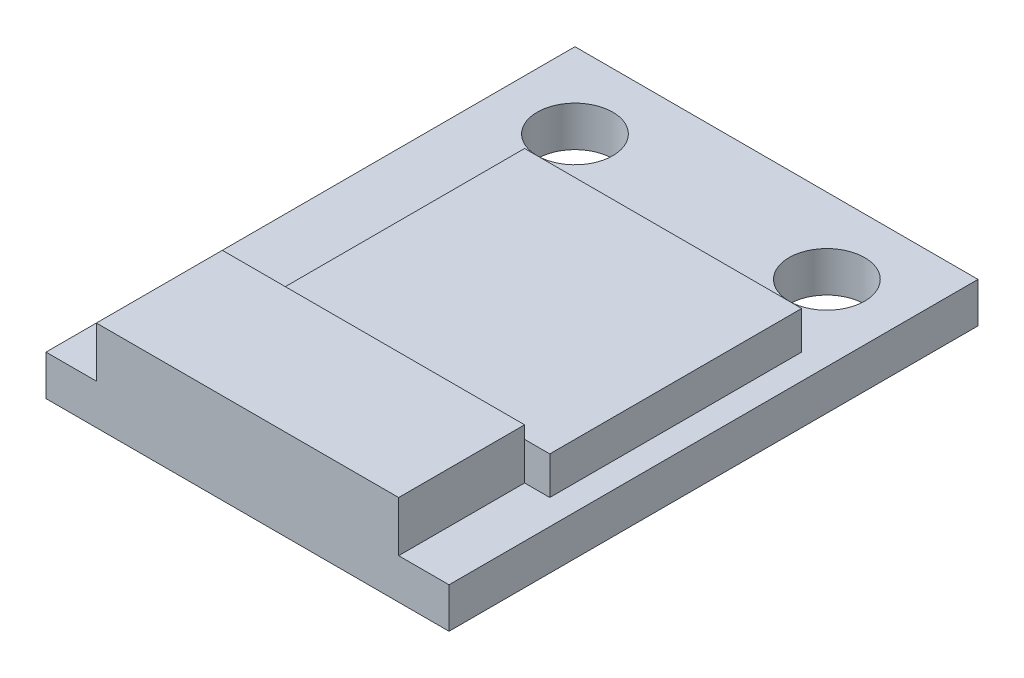
ISO-10303-21;
HEADER;
FILE_DESCRIPTION(('STEP AP214'),'2;1');
FILE_NAME('part.step','',(''),(''),'','','');
FILE_SCHEMA(('AUTOMOTIVE_DESIGN { 1 0 10303 214 1 1 1 1 }'));
ENDSEC;
DATA;
#1=APPLICATION_CONTEXT('core data for automotive mechanical design processes');
#2=APPLICATION_PROTOCOL_DEFINITION('international standard','automotive_design',2000,#1);
#3=PRODUCT_CONTEXT('',#1,'mechanical');
#4=PRODUCT('Part','Part','',(#3));
#5=PRODUCT_RELATED_PRODUCT_CATEGORY('part','',(#4));
#6=PRODUCT_DEFINITION_FORMATION('','',#4);
#7=PRODUCT_DEFINITION_CONTEXT('part definition',#1,'design');
#8=PRODUCT_DEFINITION('design','',#6,#7);
#9=PRODUCT_DEFINITION_SHAPE('','',#8);
#10=(LENGTH_UNIT() NAMED_UNIT(*) SI_UNIT(.MILLI.,.METRE.));
#11=(NAMED_UNIT(*) PLANE_ANGLE_UNIT() SI_UNIT($,.RADIAN.));
#12=(NAMED_UNIT(*) SI_UNIT($,.STERADIAN.) SOLID_ANGLE_UNIT());
#13=UNCERTAINTY_MEASURE_WITH_UNIT(LENGTH_MEASURE(1.E-05),#10,'distance_accuracy_value','');
#14=(GEOMETRIC_REPRESENTATION_CONTEXT(3) GLOBAL_UNCERTAINTY_ASSIGNED_CONTEXT((#13)) GLOBAL_UNIT_ASSIGNED_CONTEXT((#10,
#11,#12)) REPRESENTATION_CONTEXT('',''));
#15=CARTESIAN_POINT('',(0.,0.,0.));
#16=DIRECTION('',(0.,0.,1.));
#17=DIRECTION('',(1.,0.,0.));
#18=AXIS2_PLACEMENT_3D('',#15,#16,#17);
#19=CARTESIAN_POINT('',(0.,1.6,0.));
#20=DIRECTION('',(0.,-1.,0.));
#21=DIRECTION('',(0.,0.,-1.));
#22=AXIS2_PLACEMENT_3D('',#19,#20,#21);
#23=PLANE('',#22);
#24=CARTESIAN_POINT('',(3.,1.6,-18.));
#25=DIRECTION('',(0.,1.,0.));
#26=DIRECTION('',(0.,0.,1.));
#27=AXIS2_PLACEMENT_3D('',#24,#25,#26);
#28=CIRCLE('',#27,1.5);
#29=CARTESIAN_POINT('',(3.,1.6,-16.5));
#30=VERTEX_POINT('',#29);
#31=EDGE_CURVE('E195',#30,#30,#28,.T.);
#32=ORIENTED_EDGE('',*,*,#31,.F.);
#33=EDGE_LOOP('',(#32));
#34=FACE_BOUND('',#33,.T.);
#35=CARTESIAN_POINT('',(13.,1.6,-18.));
#36=DIRECTION('',(0.,1.,0.));
#37=DIRECTION('',(0.,0.,1.));
#38=AXIS2_PLACEMENT_3D('',#35,#36,#37);
#39=CIRCLE('',#38,1.5);
#40=CARTESIAN_POINT('',(13.,1.6,-16.5));
#41=VERTEX_POINT('',#40);
#42=EDGE_CURVE('E189',#41,#41,#39,.T.);
#43=ORIENTED_EDGE('',*,*,#42,.F.);
#44=EDGE_LOOP('',(#43));
#45=FACE_BOUND('',#44,.T.);
#46=DIRECTION('',(0.,0.,-1.));
#47=VECTOR('',#46,1.);
#48=CARTESIAN_POINT('',(14.,1.6,-5.));
#49=LINE('',#48,#47);
#50=CARTESIAN_POINT('',(14.,1.6,0.));
#51=VERTEX_POINT('',#50);
#52=CARTESIAN_POINT('',(14.,1.6,-5.));
#53=VERTEX_POINT('',#52);
#54=EDGE_CURVE('E245',#51,#53,#49,.T.);
#55=ORIENTED_EDGE('',*,*,#54,.F.);
#56=DIRECTION('',(1.,0.,0.));
#57=VECTOR('',#56,1.);
#58=CARTESIAN_POINT('',(0.,1.6,0.));
#59=LINE('',#58,#57);
#60=CARTESIAN_POINT('',(16.,1.6,0.));
#61=VERTEX_POINT('',#60);
#62=EDGE_CURVE('E204',#51,#61,#59,.T.);
#63=ORIENTED_EDGE('',*,*,#62,.T.);
#64=DIRECTION('',(0.,0.,-1.));
#65=VECTOR('',#64,1.);
#66=CARTESIAN_POINT('',(16.,1.6,0.));
#67=LINE('',#66,#65);
#68=CARTESIAN_POINT('',(16.,1.6,-21.));
#69=VERTEX_POINT('',#68);
#70=EDGE_CURVE('E208',#61,#69,#67,.T.);
#71=ORIENTED_EDGE('',*,*,#70,.T.);
#72=DIRECTION('',(-1.,0.,0.));
#73=VECTOR('',#72,1.);
#74=CARTESIAN_POINT('',(0.,1.6,-21.));
#75=LINE('',#74,#73);
#76=CARTESIAN_POINT('',(0.,1.6,-21.));
#77=VERTEX_POINT('',#76);
#78=EDGE_CURVE('E210',#69,#77,#75,.T.);
#79=ORIENTED_EDGE('',*,*,#78,.T.);
#80=DIRECTION('',(0.,0.,1.));
#81=VECTOR('',#80,1.);
#82=CARTESIAN_POINT('',(0.,1.6,0.));
#83=LINE('',#82,#81);
#84=CARTESIAN_POINT('',(0.,1.6,0.));
#85=VERTEX_POINT('',#84);
#86=EDGE_CURVE('E201',#77,#85,#83,.T.);
#87=ORIENTED_EDGE('',*,*,#86,.T.);
#88=CARTESIAN_POINT('',(2.,1.6,0.));
#89=VERTEX_POINT('',#88);
#90=EDGE_CURVE('E206',#85,#89,#59,.T.);
#91=ORIENTED_EDGE('',*,*,#90,.T.);
#92=DIRECTION('',(0.,0.,1.));
#93=VECTOR('',#92,1.);
#94=CARTESIAN_POINT('',(2.,1.6,-5.));
#95=LINE('',#94,#93);
#96=CARTESIAN_POINT('',(2.,1.6,-5.));
#97=VERTEX_POINT('',#96);
#98=EDGE_CURVE('E150',#97,#89,#95,.T.);
#99=ORIENTED_EDGE('',*,*,#98,.F.);
#100=DIRECTION('',(-1.,0.,0.));
#101=VECTOR('',#100,1.);
#102=CARTESIAN_POINT('',(2.,1.6,-5.));
#103=LINE('',#102,#101);
#104=CARTESIAN_POINT('',(4.,1.6,-5.));
#105=VERTEX_POINT('',#104);
#106=EDGE_CURVE('E146',#105,#97,#103,.T.);
#107=ORIENTED_EDGE('',*,*,#106,.F.);
#108=DIRECTION('',(0.,0.,1.));
#109=VECTOR('',#108,1.);
#110=CARTESIAN_POINT('',(4.,1.6,-15.));
#111=LINE('',#110,#109);
#112=CARTESIAN_POINT('',(4.,1.6,-15.));
#113=VERTEX_POINT('',#112);
#114=EDGE_CURVE('E152',#113,#105,#111,.T.);
#115=ORIENTED_EDGE('',*,*,#114,.F.);
#116=DIRECTION('',(-1.,0.,0.));
#117=VECTOR('',#116,1.);
#118=CARTESIAN_POINT('',(4.,1.6,-15.));
#119=LINE('',#118,#117);
#120=CARTESIAN_POINT('',(15.,1.6,-15.));
#121=VERTEX_POINT('',#120);
#122=EDGE_CURVE('E163',#121,#113,#119,.T.);
#123=ORIENTED_EDGE('',*,*,#122,.F.);
#124=DIRECTION('',(0.,0.,-1.));
#125=VECTOR('',#124,1.);
#126=CARTESIAN_POINT('',(15.,1.6,-15.));
#127=LINE('',#126,#125);
#128=CARTESIAN_POINT('',(15.,1.6,-5.));
#129=VERTEX_POINT('',#128);
#130=EDGE_CURVE('E173',#129,#121,#127,.T.);
#131=ORIENTED_EDGE('',*,*,#130,.F.);
#132=DIRECTION('',(1.,0.,0.));
#133=VECTOR('',#132,1.);
#134=CARTESIAN_POINT('',(4.,1.6,-5.));
#135=LINE('',#134,#133);
#136=EDGE_CURVE('E56',#53,#129,#135,.T.);
#137=ORIENTED_EDGE('',*,*,#136,.F.);
#138=EDGE_LOOP('',(#55,#63,#71,#79,#87,#91,#99,#107,#115,#123,#131,#137));
#139=FACE_BOUND('',#138,.T.);
#140=ADVANCED_FACE('F33',(#34,#45,#139),#23,.F.);
#141=CARTESIAN_POINT('',(4.,3.1,-5.));
#142=DIRECTION('',(0.,0.,-1.));
#143=DIRECTION('',(-1.,0.,0.));
#144=AXIS2_PLACEMENT_3D('',#141,#142,#143);
#145=PLANE('',#144);
#146=DIRECTION('',(0.,-1.,0.));
#147=VECTOR('',#146,1.);
#148=CARTESIAN_POINT('',(14.,3.6,-5.));
#149=LINE('',#148,#147);
#150=CARTESIAN_POINT('',(14.,3.1,-5.));
#151=VERTEX_POINT('',#150);
#152=EDGE_CURVE('E253',#151,#53,#149,.T.);
#153=ORIENTED_EDGE('',*,*,#152,.T.);
#154=ORIENTED_EDGE('',*,*,#136,.T.);
#155=DIRECTION('',(0.,-1.,0.));
#156=VECTOR('',#155,1.);
#157=CARTESIAN_POINT('',(15.,3.1,-5.));
#158=LINE('',#157,#156);
#159=CARTESIAN_POINT('',(15.,3.1,-5.));
#160=VERTEX_POINT('',#159);
#161=EDGE_CURVE('E183',#160,#129,#158,.T.);
#162=ORIENTED_EDGE('',*,*,#161,.F.);
#163=DIRECTION('',(1.,0.,0.));
#164=VECTOR('',#163,1.);
#165=CARTESIAN_POINT('',(4.,3.1,-5.));
#166=LINE('',#165,#164);
#167=EDGE_CURVE('E162',#151,#160,#166,.T.);
#168=ORIENTED_EDGE('',*,*,#167,.F.);
#169=EDGE_LOOP('',(#153,#154,#162,#168));
#170=FACE_BOUND('',#169,.T.);
#171=ADVANCED_FACE('F255',(#170),#145,.F.);
#172=CARTESIAN_POINT('',(0.,0.,0.));
#173=DIRECTION('',(0.,-1.,0.));
#174=DIRECTION('',(0.,0.,-1.));
#175=AXIS2_PLACEMENT_3D('',#172,#173,#174);
#176=PLANE('',#175);
#177=CARTESIAN_POINT('',(3.,0.,-18.));
#178=DIRECTION('',(0.,1.,0.));
#179=DIRECTION('',(0.,0.,1.));
#180=AXIS2_PLACEMENT_3D('',#177,#178,#179);
#181=CIRCLE('',#180,1.5);
#182=CARTESIAN_POINT('',(3.,0.,-16.5));
#183=VERTEX_POINT('',#182);
#184=EDGE_CURVE('E192',#183,#183,#181,.T.);
#185=ORIENTED_EDGE('',*,*,#184,.T.);
#186=EDGE_LOOP('',(#185));
#187=FACE_BOUND('',#186,.T.);
#188=DIRECTION('',(0.,0.,1.));
#189=VECTOR('',#188,1.);
#190=CARTESIAN_POINT('',(0.,0.,0.));
#191=LINE('',#190,#189);
#192=CARTESIAN_POINT('',(0.,0.,-21.));
#193=VERTEX_POINT('',#192);
#194=CARTESIAN_POINT('',(0.,0.,0.));
#195=VERTEX_POINT('',#194);
#196=EDGE_CURVE('E198',#193,#195,#191,.T.);
#197=ORIENTED_EDGE('',*,*,#196,.F.);
#198=DIRECTION('',(-1.,0.,0.));
#199=VECTOR('',#198,1.);
#200=CARTESIAN_POINT('',(0.,0.,-21.));
#201=LINE('',#200,#199);
#202=CARTESIAN_POINT('',(16.,0.,-21.));
#203=VERTEX_POINT('',#202);
#204=EDGE_CURVE('E205',#203,#193,#201,.T.);
#205=ORIENTED_EDGE('',*,*,#204,.F.);
#206=DIRECTION('',(0.,0.,-1.));
#207=VECTOR('',#206,1.);
#208=CARTESIAN_POINT('',(16.,0.,0.));
#209=LINE('',#208,#207);
#210=CARTESIAN_POINT('',(16.,0.,0.));
#211=VERTEX_POINT('',#210);
#212=EDGE_CURVE('E217',#211,#203,#209,.T.);
#213=ORIENTED_EDGE('',*,*,#212,.F.);
#214=DIRECTION('',(1.,0.,0.));
#215=VECTOR('',#214,1.);
#216=CARTESIAN_POINT('',(0.,0.,0.));
#217=LINE('',#216,#215);
#218=EDGE_CURVE('E215',#195,#211,#217,.T.);
#219=ORIENTED_EDGE('',*,*,#218,.F.);
#220=EDGE_LOOP('',(#197,#205,#213,#219));
#221=FACE_BOUND('',#220,.T.);
#222=CARTESIAN_POINT('',(13.,0.,-18.));
#223=DIRECTION('',(0.,1.,0.));
#224=DIRECTION('',(0.,0.,1.));
#225=AXIS2_PLACEMENT_3D('',#222,#223,#224);
#226=CIRCLE('',#225,1.5);
#227=CARTESIAN_POINT('',(13.,0.,-16.5));
#228=VERTEX_POINT('',#227);
#229=EDGE_CURVE('E188',#228,#228,#226,.T.);
#230=ORIENTED_EDGE('',*,*,#229,.T.);
#231=EDGE_LOOP('',(#230));
#232=FACE_BOUND('',#231,.T.);
#233=ADVANCED_FACE('F234',(#187,#221,#232),#176,.T.);
#234=CARTESIAN_POINT('',(0.,1.6,0.));
#235=DIRECTION('',(1.,0.,0.));
#236=DIRECTION('',(0.,0.,-1.));
#237=AXIS2_PLACEMENT_3D('',#234,#235,#236);
#238=PLANE('',#237);
#239=ORIENTED_EDGE('',*,*,#196,.T.);
#240=DIRECTION('',(0.,-1.,0.));
#241=VECTOR('',#240,1.);
#242=CARTESIAN_POINT('',(0.,1.6,0.));
#243=LINE('',#242,#241);
#244=EDGE_CURVE('E11',#85,#195,#243,.T.);
#245=ORIENTED_EDGE('',*,*,#244,.F.);
#246=ORIENTED_EDGE('',*,*,#86,.F.);
#247=DIRECTION('',(0.,-1.,0.));
#248=VECTOR('',#247,1.);
#249=CARTESIAN_POINT('',(0.,1.6,-21.));
#250=LINE('',#249,#248);
#251=EDGE_CURVE('E212',#77,#193,#250,.T.);
#252=ORIENTED_EDGE('',*,*,#251,.T.);
#253=EDGE_LOOP('',(#239,#245,#246,#252));
#254=FACE_BOUND('',#253,.T.);
#255=ADVANCED_FACE('F35',(#254),#238,.F.);
#256=CARTESIAN_POINT('',(0.,1.6,0.));
#257=DIRECTION('',(0.,0.,-1.));
#258=DIRECTION('',(-1.,0.,0.));
#259=AXIS2_PLACEMENT_3D('',#256,#257,#258);
#260=PLANE('',#259);
#261=ORIENTED_EDGE('',*,*,#218,.T.);
#262=DIRECTION('',(0.,-1.,0.));
#263=VECTOR('',#262,1.);
#264=CARTESIAN_POINT('',(16.,1.6,0.));
#265=LINE('',#264,#263);
#266=EDGE_CURVE('E41',#61,#211,#265,.T.);
#267=ORIENTED_EDGE('',*,*,#266,.F.);
#268=ORIENTED_EDGE('',*,*,#62,.F.);
#269=DIRECTION('',(0.,-1.,0.));
#270=VECTOR('',#269,1.);
#271=CARTESIAN_POINT('',(14.,3.6,0.));
#272=LINE('',#271,#270);
#273=CARTESIAN_POINT('',(14.,3.6,0.));
#274=VERTEX_POINT('',#273);
#275=EDGE_CURVE('E134',#274,#51,#272,.T.);
#276=ORIENTED_EDGE('',*,*,#275,.F.);
#277=DIRECTION('',(1.,0.,0.));
#278=VECTOR('',#277,1.);
#279=CARTESIAN_POINT('',(2.,3.6,0.));
#280=LINE('',#279,#278);
#281=CARTESIAN_POINT('',(2.,3.6,0.));
#282=VERTEX_POINT('',#281);
#283=EDGE_CURVE('E127',#282,#274,#280,.T.);
#284=ORIENTED_EDGE('',*,*,#283,.F.);
#285=DIRECTION('',(0.,-1.,0.));
#286=VECTOR('',#285,1.);
#287=CARTESIAN_POINT('',(2.,3.6,0.));
#288=LINE('',#287,#286);
#289=EDGE_CURVE('E131',#282,#89,#288,.T.);
#290=ORIENTED_EDGE('',*,*,#289,.T.);
#291=ORIENTED_EDGE('',*,*,#90,.F.);
#292=ORIENTED_EDGE('',*,*,#244,.T.);
#293=EDGE_LOOP('',(#261,#267,#268,#276,#284,#290,#291,#292));
#294=FACE_BOUND('',#293,.T.);
#295=ADVANCED_FACE('F129',(#294),#260,.F.);
#296=CARTESIAN_POINT('',(16.,1.6,0.));
#297=DIRECTION('',(-1.,0.,0.));
#298=DIRECTION('',(0.,0.,1.));
#299=AXIS2_PLACEMENT_3D('',#296,#297,#298);
#300=PLANE('',#299);
#301=ORIENTED_EDGE('',*,*,#212,.T.);
#302=DIRECTION('',(0.,-1.,0.));
#303=VECTOR('',#302,1.);
#304=CARTESIAN_POINT('',(16.,1.6,-21.));
#305=LINE('',#304,#303);
#306=EDGE_CURVE('E222',#69,#203,#305,.T.);
#307=ORIENTED_EDGE('',*,*,#306,.F.);
#308=ORIENTED_EDGE('',*,*,#70,.F.);
#309=ORIENTED_EDGE('',*,*,#266,.T.);
#310=EDGE_LOOP('',(#301,#307,#308,#309));
#311=FACE_BOUND('',#310,.T.);
#312=ADVANCED_FACE('F229',(#311),#300,.F.);
#313=CARTESIAN_POINT('',(0.,1.6,-21.));
#314=DIRECTION('',(0.,0.,1.));
#315=DIRECTION('',(1.,0.,0.));
#316=AXIS2_PLACEMENT_3D('',#313,#314,#315);
#317=PLANE('',#316);
#318=ORIENTED_EDGE('',*,*,#204,.T.);
#319=ORIENTED_EDGE('',*,*,#251,.F.);
#320=ORIENTED_EDGE('',*,*,#78,.F.);
#321=ORIENTED_EDGE('',*,*,#306,.T.);
#322=EDGE_LOOP('',(#318,#319,#320,#321));
#323=FACE_BOUND('',#322,.T.);
#324=ADVANCED_FACE('F238',(#323),#317,.F.);
#325=CARTESIAN_POINT('',(3.,1.6,-18.));
#326=DIRECTION('',(0.,-1.,0.));
#327=DIRECTION('',(0.,0.,-1.));
#328=AXIS2_PLACEMENT_3D('',#325,#326,#327);
#329=CYLINDRICAL_SURFACE('',#328,1.5);
#330=ORIENTED_EDGE('',*,*,#31,.T.);
#331=EDGE_LOOP('',(#330));
#332=FACE_BOUND('',#331,.T.);
#333=ORIENTED_EDGE('',*,*,#184,.F.);
#334=EDGE_LOOP('',(#333));
#335=FACE_BOUND('',#334,.T.);
#336=ADVANCED_FACE('F294',(#332,#335),#329,.F.);
#337=CARTESIAN_POINT('',(13.,1.6,-18.));
#338=DIRECTION('',(0.,-1.,0.));
#339=DIRECTION('',(0.,0.,-1.));
#340=AXIS2_PLACEMENT_3D('',#337,#338,#339);
#341=CYLINDRICAL_SURFACE('',#340,1.5);
#342=ORIENTED_EDGE('',*,*,#42,.T.);
#343=EDGE_LOOP('',(#342));
#344=FACE_BOUND('',#343,.T.);
#345=ORIENTED_EDGE('',*,*,#229,.F.);
#346=EDGE_LOOP('',(#345));
#347=FACE_BOUND('',#346,.T.);
#348=ADVANCED_FACE('F335',(#344,#347),#341,.F.);
#349=CARTESIAN_POINT('',(4.,3.1,-15.));
#350=DIRECTION('',(1.,0.,0.));
#351=DIRECTION('',(0.,0.,-1.));
#352=AXIS2_PLACEMENT_3D('',#349,#350,#351);
#353=PLANE('',#352);
#354=ORIENTED_EDGE('',*,*,#114,.T.);
#355=DIRECTION('',(0.,-1.,0.));
#356=VECTOR('',#355,1.);
#357=CARTESIAN_POINT('',(4.,3.1,-5.));
#358=LINE('',#357,#356);
#359=CARTESIAN_POINT('',(4.,3.1,-5.));
#360=VERTEX_POINT('',#359);
#361=EDGE_CURVE('E186',#360,#105,#358,.T.);
#362=ORIENTED_EDGE('',*,*,#361,.F.);
#363=DIRECTION('',(0.,0.,1.));
#364=VECTOR('',#363,1.);
#365=CARTESIAN_POINT('',(4.,3.1,-15.));
#366=LINE('',#365,#364);
#367=CARTESIAN_POINT('',(4.,3.1,-15.));
#368=VERTEX_POINT('',#367);
#369=EDGE_CURVE('E159',#368,#360,#366,.T.);
#370=ORIENTED_EDGE('',*,*,#369,.F.);
#371=DIRECTION('',(0.,-1.,0.));
#372=VECTOR('',#371,1.);
#373=CARTESIAN_POINT('',(4.,3.1,-15.));
#374=LINE('',#373,#372);
#375=EDGE_CURVE('E170',#368,#113,#374,.T.);
#376=ORIENTED_EDGE('',*,*,#375,.T.);
#377=EDGE_LOOP('',(#354,#362,#370,#376));
#378=FACE_BOUND('',#377,.T.);
#379=ADVANCED_FACE('F262',(#378),#353,.F.);
#380=CARTESIAN_POINT('',(15.,3.1,-15.));
#381=DIRECTION('',(-1.,0.,0.));
#382=DIRECTION('',(0.,0.,1.));
#383=AXIS2_PLACEMENT_3D('',#380,#381,#382);
#384=PLANE('',#383);
#385=ORIENTED_EDGE('',*,*,#130,.T.);
#386=DIRECTION('',(0.,-1.,0.));
#387=VECTOR('',#386,1.);
#388=CARTESIAN_POINT('',(15.,3.1,-15.));
#389=LINE('',#388,#387);
#390=CARTESIAN_POINT('',(15.,3.1,-15.));
#391=VERTEX_POINT('',#390);
#392=EDGE_CURVE('E180',#391,#121,#389,.T.);
#393=ORIENTED_EDGE('',*,*,#392,.F.);
#394=DIRECTION('',(0.,0.,-1.));
#395=VECTOR('',#394,1.);
#396=CARTESIAN_POINT('',(15.,3.1,-15.));
#397=LINE('',#396,#395);
#398=EDGE_CURVE('E167',#160,#391,#397,.T.);
#399=ORIENTED_EDGE('',*,*,#398,.F.);
#400=ORIENTED_EDGE('',*,*,#161,.T.);
#401=EDGE_LOOP('',(#385,#393,#399,#400));
#402=FACE_BOUND('',#401,.T.);
#403=ADVANCED_FACE('F270',(#402),#384,.F.);
#404=CARTESIAN_POINT('',(4.,3.1,-15.));
#405=DIRECTION('',(0.,0.,1.));
#406=DIRECTION('',(1.,0.,0.));
#407=AXIS2_PLACEMENT_3D('',#404,#405,#406);
#408=PLANE('',#407);
#409=ORIENTED_EDGE('',*,*,#122,.T.);
#410=ORIENTED_EDGE('',*,*,#375,.F.);
#411=DIRECTION('',(-1.,0.,0.));
#412=VECTOR('',#411,1.);
#413=CARTESIAN_POINT('',(4.,3.1,-15.));
#414=LINE('',#413,#412);
#415=EDGE_CURVE('E169',#391,#368,#414,.T.);
#416=ORIENTED_EDGE('',*,*,#415,.F.);
#417=ORIENTED_EDGE('',*,*,#392,.T.);
#418=EDGE_LOOP('',(#409,#410,#416,#417));
#419=FACE_BOUND('',#418,.T.);
#420=ADVANCED_FACE('F267',(#419),#408,.F.);
#421=CARTESIAN_POINT('',(0.,3.1,0.));
#422=DIRECTION('',(0.,1.,0.));
#423=DIRECTION('',(0.,0.,1.));
#424=AXIS2_PLACEMENT_3D('',#421,#422,#423);
#425=PLANE('',#424);
#426=ORIENTED_EDGE('',*,*,#369,.T.);
#427=EDGE_CURVE('E164',#360,#151,#166,.T.);
#428=ORIENTED_EDGE('',*,*,#427,.T.);
#429=ORIENTED_EDGE('',*,*,#167,.T.);
#430=ORIENTED_EDGE('',*,*,#398,.T.);
#431=ORIENTED_EDGE('',*,*,#415,.T.);
#432=EDGE_LOOP('',(#426,#428,#429,#430,#431));
#433=FACE_BOUND('',#432,.T.);
#434=ADVANCED_FACE('F273',(#433),#425,.T.);
#435=CARTESIAN_POINT('',(2.,3.6,-5.));
#436=DIRECTION('',(0.,0.,1.));
#437=DIRECTION('',(1.,0.,0.));
#438=AXIS2_PLACEMENT_3D('',#435,#436,#437);
#439=PLANE('',#438);
#440=ORIENTED_EDGE('',*,*,#427,.F.);
#441=ORIENTED_EDGE('',*,*,#361,.T.);
#442=ORIENTED_EDGE('',*,*,#106,.T.);
#443=DIRECTION('',(0.,-1.,0.));
#444=VECTOR('',#443,1.);
#445=CARTESIAN_POINT('',(2.,3.6,-5.));
#446=LINE('',#445,#444);
#447=CARTESIAN_POINT('',(2.,3.6,-5.));
#448=VERTEX_POINT('',#447);
#449=EDGE_CURVE('E252',#448,#97,#446,.T.);
#450=ORIENTED_EDGE('',*,*,#449,.F.);
#451=DIRECTION('',(-1.,0.,0.));
#452=VECTOR('',#451,1.);
#453=CARTESIAN_POINT('',(2.,3.6,-5.));
#454=LINE('',#453,#452);
#455=CARTESIAN_POINT('',(14.,3.6,-5.));
#456=VERTEX_POINT('',#455);
#457=EDGE_CURVE('E142',#456,#448,#454,.T.);
#458=ORIENTED_EDGE('',*,*,#457,.F.);
#459=EDGE_CURVE('E48',#456,#151,#149,.T.);
#460=ORIENTED_EDGE('',*,*,#459,.T.);
#461=EDGE_LOOP('',(#440,#441,#442,#450,#458,#460));
#462=FACE_BOUND('',#461,.T.);
#463=ADVANCED_FACE('F257',(#462),#439,.F.);
#464=CARTESIAN_POINT('',(2.,3.6,-5.));
#465=DIRECTION('',(1.,0.,0.));
#466=DIRECTION('',(0.,0.,-1.));
#467=AXIS2_PLACEMENT_3D('',#464,#465,#466);
#468=PLANE('',#467);
#469=ORIENTED_EDGE('',*,*,#98,.T.);
#470=ORIENTED_EDGE('',*,*,#289,.F.);
#471=DIRECTION('',(0.,0.,1.));
#472=VECTOR('',#471,1.);
#473=CARTESIAN_POINT('',(2.,3.6,-5.));
#474=LINE('',#473,#472);
#475=EDGE_CURVE('E138',#448,#282,#474,.T.);
#476=ORIENTED_EDGE('',*,*,#475,.F.);
#477=ORIENTED_EDGE('',*,*,#449,.T.);
#478=EDGE_LOOP('',(#469,#470,#476,#477));
#479=FACE_BOUND('',#478,.T.);
#480=ADVANCED_FACE('F148',(#479),#468,.F.);
#481=CARTESIAN_POINT('',(14.,3.6,-5.));
#482=DIRECTION('',(-1.,0.,0.));
#483=DIRECTION('',(0.,0.,1.));
#484=AXIS2_PLACEMENT_3D('',#481,#482,#483);
#485=PLANE('',#484);
#486=ORIENTED_EDGE('',*,*,#54,.T.);
#487=ORIENTED_EDGE('',*,*,#152,.F.);
#488=ORIENTED_EDGE('',*,*,#459,.F.);
#489=DIRECTION('',(0.,0.,-1.));
#490=VECTOR('',#489,1.);
#491=CARTESIAN_POINT('',(14.,3.6,-5.));
#492=LINE('',#491,#490);
#493=EDGE_CURVE('E137',#274,#456,#492,.T.);
#494=ORIENTED_EDGE('',*,*,#493,.F.);
#495=ORIENTED_EDGE('',*,*,#275,.T.);
#496=EDGE_LOOP('',(#486,#487,#488,#494,#495));
#497=FACE_BOUND('',#496,.T.);
#498=ADVANCED_FACE('F256',(#497),#485,.F.);
#499=CARTESIAN_POINT('',(0.,3.6,0.));
#500=DIRECTION('',(0.,1.,0.));
#501=DIRECTION('',(0.,0.,1.));
#502=AXIS2_PLACEMENT_3D('',#499,#500,#501);
#503=PLANE('',#502);
#504=ORIENTED_EDGE('',*,*,#475,.T.);
#505=ORIENTED_EDGE('',*,*,#283,.T.);
#506=ORIENTED_EDGE('',*,*,#493,.T.);
#507=ORIENTED_EDGE('',*,*,#457,.T.);
#508=EDGE_LOOP('',(#504,#505,#506,#507));
#509=FACE_BOUND('',#508,.T.);
#510=ADVANCED_FACE('F141',(#509),#503,.T.);
#511=CLOSED_SHELL('',(#140,#171,#233,#255,#295,#312,#324,#336,#348,#379,#403,#420,#434,#463,
#480,#498,#510));
#512=MANIFOLD_SOLID_BREP('B2',#511);
#513=ADVANCED_BREP_SHAPE_REPRESENTATION('',(#18,#512),#14);
#514=SHAPE_DEFINITION_REPRESENTATION(#9,#513);
ENDSEC;
END-ISO-10303-21;
